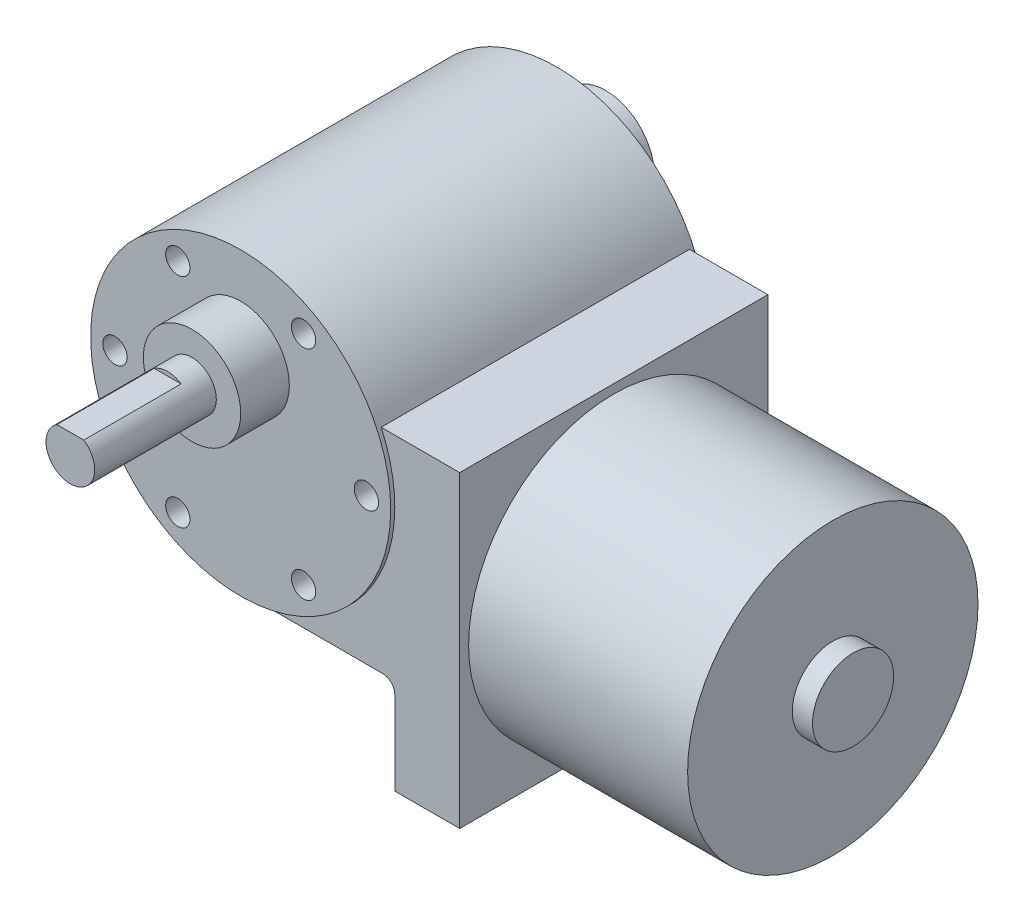
ISO-10303-21;
HEADER;
FILE_DESCRIPTION(('STEP AP214'),'2;1');
FILE_NAME('part.step','',(''),(''),'','','');
FILE_SCHEMA(('AUTOMOTIVE_DESIGN { 1 0 10303 214 1 1 1 1 }'));
ENDSEC;
DATA;
#1=APPLICATION_CONTEXT('core data for automotive mechanical design processes');
#2=APPLICATION_PROTOCOL_DEFINITION('international standard','automotive_design',2000,#1);
#3=PRODUCT_CONTEXT('',#1,'mechanical');
#4=PRODUCT('Part','Part','',(#3));
#5=PRODUCT_RELATED_PRODUCT_CATEGORY('part','',(#4));
#6=PRODUCT_DEFINITION_FORMATION('','',#4);
#7=PRODUCT_DEFINITION_CONTEXT('part definition',#1,'design');
#8=PRODUCT_DEFINITION('design','',#6,#7);
#9=PRODUCT_DEFINITION_SHAPE('','',#8);
#10=(LENGTH_UNIT() NAMED_UNIT(*) SI_UNIT(.MILLI.,.METRE.));
#11=(NAMED_UNIT(*) PLANE_ANGLE_UNIT() SI_UNIT($,.RADIAN.));
#12=(NAMED_UNIT(*) SI_UNIT($,.STERADIAN.) SOLID_ANGLE_UNIT());
#13=UNCERTAINTY_MEASURE_WITH_UNIT(LENGTH_MEASURE(1.E-05),#10,'distance_accuracy_value','');
#14=(GEOMETRIC_REPRESENTATION_CONTEXT(3) GLOBAL_UNCERTAINTY_ASSIGNED_CONTEXT((#13)) GLOBAL_UNIT_ASSIGNED_CONTEXT((#10,
#11,#12)) REPRESENTATION_CONTEXT('',''));
#15=CARTESIAN_POINT('',(0.,0.,0.));
#16=DIRECTION('',(0.,0.,1.));
#17=DIRECTION('',(1.,0.,0.));
#18=AXIS2_PLACEMENT_3D('',#15,#16,#17);
#19=CARTESIAN_POINT('',(0.,-7.,-39.));
#20=DIRECTION('',(0.,0.,1.));
#21=DIRECTION('',(1.,0.,0.));
#22=AXIS2_PLACEMENT_3D('',#19,#20,#21);
#23=CYLINDRICAL_SURFACE('',#22,18.5);
#24=CARTESIAN_POINT('',(0.,-7.,-39.));
#25=DIRECTION('',(0.,0.,1.));
#26=DIRECTION('',(1.,0.,0.));
#27=AXIS2_PLACEMENT_3D('',#24,#25,#26);
#28=CIRCLE('',#27,18.5);
#29=CARTESIAN_POINT('',(18.5,-7.,-39.));
#30=VERTEX_POINT('',#29);
#31=EDGE_CURVE('E166',#30,#30,#28,.T.);
#32=ORIENTED_EDGE('',*,*,#31,.T.);
#33=EDGE_LOOP('',(#32));
#34=FACE_BOUND('',#33,.T.);
#35=CARTESIAN_POINT('',(0.,-7.,0.));
#36=DIRECTION('',(0.,0.,1.));
#37=DIRECTION('',(1.,0.,0.));
#38=AXIS2_PLACEMENT_3D('',#35,#36,#37);
#39=CIRCLE('',#38,18.5);
#40=CARTESIAN_POINT('',(18.5,-7.,0.));
#41=VERTEX_POINT('',#40);
#42=EDGE_CURVE('E165',#41,#41,#39,.T.);
#43=ORIENTED_EDGE('',*,*,#42,.F.);
#44=EDGE_LOOP('',(#43));
#45=FACE_BOUND('',#44,.T.);
#46=CARTESIAN_POINT('',(0.,-7.,-0.5));
#47=DIRECTION('',(0.,0.,-1.));
#48=DIRECTION('',(0.,1.,0.));
#49=AXIS2_PLACEMENT_3D('',#46,#47,#48);
#50=CIRCLE('',#49,18.5);
#51=CARTESIAN_POINT('',(16.8214149226514,0.7,-0.5));
#52=VERTEX_POINT('',#51);
#53=CARTESIAN_POINT('',(0.,-25.5,-0.500000000000001));
#54=VERTEX_POINT('',#53);
#55=EDGE_CURVE('E116',#52,#54,#50,.T.);
#56=ORIENTED_EDGE('',*,*,#55,.F.);
#57=DIRECTION('',(0.,0.,1.));
#58=VECTOR('',#57,1.);
#59=CARTESIAN_POINT('',(16.8214149226514,0.7,-39.));
#60=LINE('',#59,#58);
#61=CARTESIAN_POINT('',(16.8214149226514,0.7,-38.5));
#62=VERTEX_POINT('',#61);
#63=EDGE_CURVE('E121',#62,#52,#60,.T.);
#64=ORIENTED_EDGE('',*,*,#63,.F.);
#65=CARTESIAN_POINT('',(0.,-7.,-38.5));
#66=DIRECTION('',(0.,0.,1.));
#67=DIRECTION('',(1.,0.,0.));
#68=AXIS2_PLACEMENT_3D('',#65,#66,#67);
#69=CIRCLE('',#68,18.5);
#70=CARTESIAN_POINT('',(0.,-25.5,-38.5));
#71=VERTEX_POINT('',#70);
#72=EDGE_CURVE('E104',#71,#62,#69,.T.);
#73=ORIENTED_EDGE('',*,*,#72,.F.);
#74=DIRECTION('',(0.,0.,1.));
#75=VECTOR('',#74,1.);
#76=CARTESIAN_POINT('',(0.,-25.5,-39.));
#77=LINE('',#76,#75);
#78=EDGE_CURVE('E115',#71,#54,#77,.T.);
#79=ORIENTED_EDGE('',*,*,#78,.T.);
#80=EDGE_LOOP('',(#56,#64,#73,#79));
#81=FACE_BOUND('',#80,.T.);
#82=ADVANCED_FACE('F34',(#34,#45,#81),#23,.T.);
#83=CARTESIAN_POINT('',(0.,0.,21.));
#84=DIRECTION('',(0.,0.,-1.));
#85=DIRECTION('',(-1.,0.,0.));
#86=AXIS2_PLACEMENT_3D('',#83,#84,#85);
#87=CYLINDRICAL_SURFACE('',#86,3.);
#88=CARTESIAN_POINT('',(0.,0.,6.));
#89=DIRECTION('',(0.,0.,1.));
#90=DIRECTION('',(1.,0.,0.));
#91=AXIS2_PLACEMENT_3D('',#88,#89,#90);
#92=CIRCLE('',#91,3.);
#93=CARTESIAN_POINT('',(3.,0.,6.));
#94=VERTEX_POINT('',#93);
#95=EDGE_CURVE('E187',#94,#94,#92,.T.);
#96=ORIENTED_EDGE('',*,*,#95,.T.);
#97=EDGE_LOOP('',(#96));
#98=FACE_BOUND('',#97,.T.);
#99=CARTESIAN_POINT('',(0.,0.,9.));
#100=DIRECTION('',(0.,0.,1.));
#101=DIRECTION('',(1.,0.,0.));
#102=AXIS2_PLACEMENT_3D('',#99,#100,#101);
#103=CIRCLE('',#102,3.);
#104=CARTESIAN_POINT('',(1.6583123951777,2.5,9.));
#105=VERTEX_POINT('',#104);
#106=CARTESIAN_POINT('',(-1.6583123951777,2.5,9.));
#107=VERTEX_POINT('',#106);
#108=EDGE_CURVE('E190',#105,#107,#103,.T.);
#109=ORIENTED_EDGE('',*,*,#108,.F.);
#110=DIRECTION('',(0.,0.,1.));
#111=VECTOR('',#110,1.);
#112=CARTESIAN_POINT('',(1.6583123951777,2.5,9.));
#113=LINE('',#112,#111);
#114=CARTESIAN_POINT('',(1.6583123951777,2.5,21.));
#115=VERTEX_POINT('',#114);
#116=EDGE_CURVE('E175',#105,#115,#113,.T.);
#117=ORIENTED_EDGE('',*,*,#116,.T.);
#118=CARTESIAN_POINT('',(0.,0.,21.));
#119=DIRECTION('',(0.,0.,1.));
#120=DIRECTION('',(1.,0.,0.));
#121=AXIS2_PLACEMENT_3D('',#118,#119,#120);
#122=CIRCLE('',#121,3.);
#123=CARTESIAN_POINT('',(-1.6583123951777,2.5,21.));
#124=VERTEX_POINT('',#123);
#125=EDGE_CURVE('E181',#124,#115,#122,.T.);
#126=ORIENTED_EDGE('',*,*,#125,.F.);
#127=DIRECTION('',(0.,0.,1.));
#128=VECTOR('',#127,1.);
#129=CARTESIAN_POINT('',(-1.6583123951777,2.5,9.));
#130=LINE('',#129,#128);
#131=EDGE_CURVE('E179',#107,#124,#130,.T.);
#132=ORIENTED_EDGE('',*,*,#131,.F.);
#133=EDGE_LOOP('',(#109,#117,#126,#132));
#134=FACE_BOUND('',#133,.T.);
#135=ADVANCED_FACE('F281',(#98,#134),#87,.T.);
#136=CARTESIAN_POINT('',(0.,0.,21.));
#137=DIRECTION('',(0.,0.,1.));
#138=DIRECTION('',(1.,0.,0.));
#139=AXIS2_PLACEMENT_3D('',#136,#137,#138);
#140=PLANE('',#139);
#141=ORIENTED_EDGE('',*,*,#125,.T.);
#142=DIRECTION('',(-1.,0.,0.));
#143=VECTOR('',#142,1.);
#144=CARTESIAN_POINT('',(-1.6583123951777,2.5,21.));
#145=LINE('',#144,#143);
#146=EDGE_CURVE('E176',#115,#124,#145,.T.);
#147=ORIENTED_EDGE('',*,*,#146,.T.);
#148=EDGE_LOOP('',(#141,#147));
#149=FACE_BOUND('',#148,.T.);
#150=ADVANCED_FACE('F287',(#149),#140,.T.);
#151=CARTESIAN_POINT('',(0.,0.,6.));
#152=DIRECTION('',(0.,0.,-1.));
#153=DIRECTION('',(-1.,0.,0.));
#154=AXIS2_PLACEMENT_3D('',#151,#152,#153);
#155=CYLINDRICAL_SURFACE('',#154,6.);
#156=CARTESIAN_POINT('',(0.,0.,6.));
#157=DIRECTION('',(0.,0.,1.));
#158=DIRECTION('',(1.,0.,0.));
#159=AXIS2_PLACEMENT_3D('',#156,#157,#158);
#160=CIRCLE('',#159,6.);
#161=CARTESIAN_POINT('',(6.,0.,6.));
#162=VERTEX_POINT('',#161);
#163=EDGE_CURVE('E186',#162,#162,#160,.T.);
#164=ORIENTED_EDGE('',*,*,#163,.F.);
#165=EDGE_LOOP('',(#164));
#166=FACE_BOUND('',#165,.T.);
#167=CARTESIAN_POINT('',(0.,0.,0.));
#168=DIRECTION('',(0.,0.,1.));
#169=DIRECTION('',(1.,0.,0.));
#170=AXIS2_PLACEMENT_3D('',#167,#168,#169);
#171=CIRCLE('',#170,6.);
#172=CARTESIAN_POINT('',(6.,0.,0.));
#173=VERTEX_POINT('',#172);
#174=EDGE_CURVE('E169',#173,#173,#171,.T.);
#175=ORIENTED_EDGE('',*,*,#174,.T.);
#176=EDGE_LOOP('',(#175));
#177=FACE_BOUND('',#176,.T.);
#178=ADVANCED_FACE('F302',(#166,#177),#155,.T.);
#179=CARTESIAN_POINT('',(0.,0.,6.));
#180=DIRECTION('',(0.,0.,1.));
#181=DIRECTION('',(1.,0.,0.));
#182=AXIS2_PLACEMENT_3D('',#179,#180,#181);
#183=PLANE('',#182);
#184=ORIENTED_EDGE('',*,*,#95,.F.);
#185=EDGE_LOOP('',(#184));
#186=FACE_BOUND('',#185,.T.);
#187=ORIENTED_EDGE('',*,*,#163,.T.);
#188=EDGE_LOOP('',(#187));
#189=FACE_BOUND('',#188,.T.);
#190=ADVANCED_FACE('F299',(#186,#189),#183,.T.);
#191=CARTESIAN_POINT('',(0.,0.,9.));
#192=DIRECTION('',(0.,0.,1.));
#193=DIRECTION('',(1.,0.,0.));
#194=AXIS2_PLACEMENT_3D('',#191,#192,#193);
#195=PLANE('',#194);
#196=ORIENTED_EDGE('',*,*,#108,.T.);
#197=DIRECTION('',(-1.,0.,0.));
#198=VECTOR('',#197,1.);
#199=CARTESIAN_POINT('',(-1.6583123951777,2.5,9.));
#200=LINE('',#199,#198);
#201=EDGE_CURVE('E172',#105,#107,#200,.T.);
#202=ORIENTED_EDGE('',*,*,#201,.F.);
#203=EDGE_LOOP('',(#196,#202));
#204=FACE_BOUND('',#203,.T.);
#205=ADVANCED_FACE('F295',(#204),#195,.T.);
#206=CARTESIAN_POINT('',(-1.6583123951777,2.5,9.));
#207=DIRECTION('',(0.,1.,0.));
#208=DIRECTION('',(0.,0.,1.));
#209=AXIS2_PLACEMENT_3D('',#206,#207,#208);
#210=PLANE('',#209);
#211=ORIENTED_EDGE('',*,*,#146,.F.);
#212=ORIENTED_EDGE('',*,*,#116,.F.);
#213=ORIENTED_EDGE('',*,*,#201,.T.);
#214=ORIENTED_EDGE('',*,*,#131,.T.);
#215=EDGE_LOOP('',(#211,#212,#213,#214));
#216=FACE_BOUND('',#215,.T.);
#217=ADVANCED_FACE('F292',(#216),#210,.T.);
#218=CARTESIAN_POINT('',(0.,-7.,-39.));
#219=DIRECTION('',(0.,0.,1.));
#220=DIRECTION('',(1.,0.,0.));
#221=AXIS2_PLACEMENT_3D('',#218,#219,#220);
#222=PLANE('',#221);
#223=CARTESIAN_POINT('',(0.,0.,-39.));
#224=DIRECTION('',(0.,0.,1.));
#225=DIRECTION('',(1.,0.,0.));
#226=AXIS2_PLACEMENT_3D('',#223,#224,#225);
#227=CIRCLE('',#226,6.);
#228=CARTESIAN_POINT('',(6.,0.,-39.));
#229=VERTEX_POINT('',#228);
#230=EDGE_CURVE('E196',#229,#229,#227,.F.);
#231=ORIENTED_EDGE('',*,*,#230,.F.);
#232=EDGE_LOOP('',(#231));
#233=FACE_BOUND('',#232,.T.);
#234=ORIENTED_EDGE('',*,*,#31,.F.);
#235=EDGE_LOOP('',(#234));
#236=FACE_BOUND('',#235,.T.);
#237=ADVANCED_FACE('F264',(#233,#236),#222,.F.);
#238=CARTESIAN_POINT('',(0.,-7.,0.));
#239=DIRECTION('',(0.,0.,1.));
#240=DIRECTION('',(1.,0.,0.));
#241=AXIS2_PLACEMENT_3D('',#238,#239,#240);
#242=PLANE('',#241);
#243=CARTESIAN_POINT('',(-15.5,-7.,0.));
#244=DIRECTION('',(0.,0.,1.));
#245=DIRECTION('',(1.,0.,0.));
#246=AXIS2_PLACEMENT_3D('',#243,#244,#245);
#247=CIRCLE('',#246,1.5);
#248=CARTESIAN_POINT('',(-14.,-7.,0.));
#249=VERTEX_POINT('',#248);
#250=EDGE_CURVE('E240',#249,#249,#247,.T.);
#251=ORIENTED_EDGE('',*,*,#250,.F.);
#252=EDGE_LOOP('',(#251));
#253=FACE_BOUND('',#252,.T.);
#254=CARTESIAN_POINT('',(-7.74999999999999,-20.4233937586588,0.));
#255=DIRECTION('',(0.,0.,1.));
#256=DIRECTION('',(1.,0.,0.));
#257=AXIS2_PLACEMENT_3D('',#254,#255,#256);
#258=CIRCLE('',#257,1.50000000000006);
#259=CARTESIAN_POINT('',(-6.24999999999993,-20.4233937586588,0.));
#260=VERTEX_POINT('',#259);
#261=EDGE_CURVE('E241',#260,#260,#258,.T.);
#262=ORIENTED_EDGE('',*,*,#261,.F.);
#263=EDGE_LOOP('',(#262));
#264=FACE_BOUND('',#263,.T.);
#265=CARTESIAN_POINT('',(7.75000000000001,-20.4233937586588,0.));
#266=DIRECTION('',(0.,0.,1.));
#267=DIRECTION('',(1.,0.,0.));
#268=AXIS2_PLACEMENT_3D('',#265,#266,#267);
#269=CIRCLE('',#268,1.50000000000005);
#270=CARTESIAN_POINT('',(9.25000000000005,-20.4233937586588,0.));
#271=VERTEX_POINT('',#270);
#272=EDGE_CURVE('E215',#271,#271,#269,.T.);
#273=ORIENTED_EDGE('',*,*,#272,.F.);
#274=EDGE_LOOP('',(#273));
#275=FACE_BOUND('',#274,.T.);
#276=CARTESIAN_POINT('',(15.5,-7.00000000000011,0.));
#277=DIRECTION('',(0.,0.,1.));
#278=DIRECTION('',(1.,0.,0.));
#279=AXIS2_PLACEMENT_3D('',#276,#277,#278);
#280=CIRCLE('',#279,1.5);
#281=CARTESIAN_POINT('',(17.,-7.00000000000011,0.));
#282=VERTEX_POINT('',#281);
#283=EDGE_CURVE('E222',#282,#282,#280,.T.);
#284=ORIENTED_EDGE('',*,*,#283,.F.);
#285=EDGE_LOOP('',(#284));
#286=FACE_BOUND('',#285,.T.);
#287=CARTESIAN_POINT('',(7.75000000000006,6.42339375865877,0.));
#288=DIRECTION('',(0.,0.,1.));
#289=DIRECTION('',(1.,0.,0.));
#290=AXIS2_PLACEMENT_3D('',#287,#288,#289);
#291=CIRCLE('',#290,1.5);
#292=CARTESIAN_POINT('',(9.25000000000007,6.42339375865877,0.));
#293=VERTEX_POINT('',#292);
#294=EDGE_CURVE('E228',#293,#293,#291,.T.);
#295=ORIENTED_EDGE('',*,*,#294,.F.);
#296=EDGE_LOOP('',(#295));
#297=FACE_BOUND('',#296,.T.);
#298=CARTESIAN_POINT('',(-7.74999999999997,6.42339375865882,0.));
#299=DIRECTION('',(0.,0.,1.));
#300=DIRECTION('',(1.,0.,0.));
#301=AXIS2_PLACEMENT_3D('',#298,#299,#300);
#302=CIRCLE('',#301,1.5);
#303=CARTESIAN_POINT('',(-6.24999999999997,6.42339375865882,0.));
#304=VERTEX_POINT('',#303);
#305=EDGE_CURVE('E234',#304,#304,#302,.T.);
#306=ORIENTED_EDGE('',*,*,#305,.F.);
#307=EDGE_LOOP('',(#306));
#308=FACE_BOUND('',#307,.T.);
#309=ORIENTED_EDGE('',*,*,#174,.F.);
#310=EDGE_LOOP('',(#309));
#311=FACE_BOUND('',#310,.T.);
#312=ORIENTED_EDGE('',*,*,#42,.T.);
#313=EDGE_LOOP('',(#312));
#314=FACE_BOUND('',#313,.T.);
#315=ADVANCED_FACE('F260',(#253,#264,#275,#286,#297,#308,#311,#314),#242,.T.);
#316=CARTESIAN_POINT('',(0.,0.,-45.));
#317=DIRECTION('',(0.,0.,1.));
#318=DIRECTION('',(1.,0.,0.));
#319=AXIS2_PLACEMENT_3D('',#316,#317,#318);
#320=CYLINDRICAL_SURFACE('',#319,6.);
#321=CARTESIAN_POINT('',(0.,0.,-45.));
#322=DIRECTION('',(0.,0.,-1.));
#323=DIRECTION('',(-1.,0.,0.));
#324=AXIS2_PLACEMENT_3D('',#321,#322,#323);
#325=CIRCLE('',#324,6.);
#326=CARTESIAN_POINT('',(-6.,0.,-45.));
#327=VERTEX_POINT('',#326);
#328=EDGE_CURVE('E161',#327,#327,#325,.T.);
#329=ORIENTED_EDGE('',*,*,#328,.F.);
#330=EDGE_LOOP('',(#329));
#331=FACE_BOUND('',#330,.T.);
#332=ORIENTED_EDGE('',*,*,#230,.T.);
#333=EDGE_LOOP('',(#332));
#334=FACE_BOUND('',#333,.T.);
#335=ADVANCED_FACE('F263',(#331,#334),#320,.T.);
#336=CARTESIAN_POINT('',(0.,0.,-45.));
#337=DIRECTION('',(0.,0.,-1.));
#338=DIRECTION('',(-1.,0.,0.));
#339=AXIS2_PLACEMENT_3D('',#336,#337,#338);
#340=PLANE('',#339);
#341=ORIENTED_EDGE('',*,*,#328,.T.);
#342=EDGE_LOOP('',(#341));
#343=FACE_BOUND('',#342,.T.);
#344=ADVANCED_FACE('F347',(#343),#340,.T.);
#345=CARTESIAN_POINT('',(-18.502,-25.5,-38.5));
#346=DIRECTION('',(0.,1.,0.));
#347=DIRECTION('',(0.,0.,1.));
#348=AXIS2_PLACEMENT_3D('',#345,#346,#347);
#349=PLANE('',#348);
#350=DIRECTION('',(1.,0.,0.));
#351=VECTOR('',#350,1.);
#352=CARTESIAN_POINT('',(-18.502,-25.5,-38.5));
#353=LINE('',#352,#351);
#354=CARTESIAN_POINT('',(17.,-25.5,-38.5));
#355=VERTEX_POINT('',#354);
#356=EDGE_CURVE('E111',#71,#355,#353,.T.);
#357=ORIENTED_EDGE('',*,*,#356,.T.);
#358=DIRECTION('',(0.,0.,1.));
#359=VECTOR('',#358,1.);
#360=CARTESIAN_POINT('',(17.,-25.5,-38.5));
#361=LINE('',#360,#359);
#362=CARTESIAN_POINT('',(17.,-25.5,-0.5));
#363=VERTEX_POINT('',#362);
#364=EDGE_CURVE('E199',#355,#363,#361,.T.);
#365=ORIENTED_EDGE('',*,*,#364,.T.);
#366=DIRECTION('',(1.,0.,0.));
#367=VECTOR('',#366,1.);
#368=CARTESIAN_POINT('',(-18.502,-25.5,-0.5));
#369=LINE('',#368,#367);
#370=EDGE_CURVE('E154',#54,#363,#369,.T.);
#371=ORIENTED_EDGE('',*,*,#370,.F.);
#372=ORIENTED_EDGE('',*,*,#78,.F.);
#373=EDGE_LOOP('',(#357,#365,#371,#372));
#374=FACE_BOUND('',#373,.T.);
#375=ADVANCED_FACE('F355',(#374),#349,.F.);
#376=CARTESIAN_POINT('',(-18.502,0.7,-0.5));
#377=DIRECTION('',(0.,0.,-1.));
#378=DIRECTION('',(0.,1.,0.));
#379=AXIS2_PLACEMENT_3D('',#376,#377,#378);
#380=PLANE('',#379);
#381=ORIENTED_EDGE('',*,*,#370,.T.);
#382=CARTESIAN_POINT('',(17.,-27.,-0.5));
#383=DIRECTION('',(0.,0.,-1.));
#384=DIRECTION('',(0.,1.,0.));
#385=AXIS2_PLACEMENT_3D('',#382,#383,#384);
#386=CIRCLE('',#385,1.5);
#387=CARTESIAN_POINT('',(18.5,-27.,-0.5));
#388=VERTEX_POINT('',#387);
#389=EDGE_CURVE('E42',#363,#388,#386,.T.);
#390=ORIENTED_EDGE('',*,*,#389,.T.);
#391=DIRECTION('',(0.,-1.,0.));
#392=VECTOR('',#391,1.);
#393=CARTESIAN_POINT('',(18.5,-37.3,-0.5));
#394=LINE('',#393,#392);
#395=CARTESIAN_POINT('',(18.5,-37.3,-0.5));
#396=VERTEX_POINT('',#395);
#397=EDGE_CURVE('E141',#388,#396,#394,.T.);
#398=ORIENTED_EDGE('',*,*,#397,.T.);
#399=DIRECTION('',(1.,0.,0.));
#400=VECTOR('',#399,1.);
#401=CARTESIAN_POINT('',(18.5,-37.3,-0.5));
#402=LINE('',#401,#400);
#403=CARTESIAN_POINT('',(26.5,-37.3,-0.5));
#404=VERTEX_POINT('',#403);
#405=EDGE_CURVE('E155',#396,#404,#402,.T.);
#406=ORIENTED_EDGE('',*,*,#405,.T.);
#407=DIRECTION('',(0.,-1.,0.));
#408=VECTOR('',#407,1.);
#409=CARTESIAN_POINT('',(26.5,-37.3,-0.5));
#410=LINE('',#409,#408);
#411=CARTESIAN_POINT('',(26.5,0.7,-0.5));
#412=VERTEX_POINT('',#411);
#413=EDGE_CURVE('E147',#412,#404,#410,.T.);
#414=ORIENTED_EDGE('',*,*,#413,.F.);
#415=DIRECTION('',(1.,0.,0.));
#416=VECTOR('',#415,1.);
#417=CARTESIAN_POINT('',(18.5,0.7,-0.5));
#418=LINE('',#417,#416);
#419=EDGE_CURVE('E125',#52,#412,#418,.T.);
#420=ORIENTED_EDGE('',*,*,#419,.F.);
#421=ORIENTED_EDGE('',*,*,#55,.T.);
#422=EDGE_LOOP('',(#381,#390,#398,#406,#414,#420,#421));
#423=FACE_BOUND('',#422,.T.);
#424=ADVANCED_FACE('F363',(#423),#380,.F.);
#425=CARTESIAN_POINT('',(-18.502,0.7,-38.5));
#426=DIRECTION('',(0.,0.,1.));
#427=DIRECTION('',(1.,0.,0.));
#428=AXIS2_PLACEMENT_3D('',#425,#426,#427);
#429=PLANE('',#428);
#430=ORIENTED_EDGE('',*,*,#356,.F.);
#431=ORIENTED_EDGE('',*,*,#72,.T.);
#432=DIRECTION('',(1.,0.,0.));
#433=VECTOR('',#432,1.);
#434=CARTESIAN_POINT('',(18.5,0.7,-38.5));
#435=LINE('',#434,#433);
#436=CARTESIAN_POINT('',(26.5,0.7,-38.5));
#437=VERTEX_POINT('',#436);
#438=EDGE_CURVE('E108',#62,#437,#435,.T.);
#439=ORIENTED_EDGE('',*,*,#438,.T.);
#440=DIRECTION('',(0.,1.,0.));
#441=VECTOR('',#440,1.);
#442=CARTESIAN_POINT('',(26.5,-37.3,-38.5));
#443=LINE('',#442,#441);
#444=CARTESIAN_POINT('',(26.5,-37.3,-38.5));
#445=VERTEX_POINT('',#444);
#446=EDGE_CURVE('E129',#445,#437,#443,.T.);
#447=ORIENTED_EDGE('',*,*,#446,.F.);
#448=DIRECTION('',(1.,0.,0.));
#449=VECTOR('',#448,1.);
#450=CARTESIAN_POINT('',(18.5,-37.3,-38.5));
#451=LINE('',#450,#449);
#452=CARTESIAN_POINT('',(18.5,-37.3,-38.5));
#453=VERTEX_POINT('',#452);
#454=EDGE_CURVE('E152',#453,#445,#451,.T.);
#455=ORIENTED_EDGE('',*,*,#454,.F.);
#456=DIRECTION('',(0.,1.,0.));
#457=VECTOR('',#456,1.);
#458=CARTESIAN_POINT('',(18.5,-37.3,-38.5));
#459=LINE('',#458,#457);
#460=CARTESIAN_POINT('',(18.5,-27.,-38.5));
#461=VERTEX_POINT('',#460);
#462=EDGE_CURVE('E139',#453,#461,#459,.T.);
#463=ORIENTED_EDGE('',*,*,#462,.T.);
#464=CARTESIAN_POINT('',(17.,-27.,-38.5));
#465=DIRECTION('',(0.,0.,1.));
#466=DIRECTION('',(1.,0.,0.));
#467=AXIS2_PLACEMENT_3D('',#464,#465,#466);
#468=CIRCLE('',#467,1.5);
#469=EDGE_CURVE('E12',#461,#355,#468,.T.);
#470=ORIENTED_EDGE('',*,*,#469,.T.);
#471=EDGE_LOOP('',(#430,#431,#439,#447,#455,#463,#470));
#472=FACE_BOUND('',#471,.T.);
#473=ADVANCED_FACE('F106',(#472),#429,.F.);
#474=CARTESIAN_POINT('',(18.5,0.,0.));
#475=DIRECTION('',(-1.,0.,0.));
#476=DIRECTION('',(0.,0.,1.));
#477=AXIS2_PLACEMENT_3D('',#474,#475,#476);
#478=PLANE('',#477);
#479=ORIENTED_EDGE('',*,*,#397,.F.);
#480=DIRECTION('',(0.,0.,1.));
#481=VECTOR('',#480,1.);
#482=CARTESIAN_POINT('',(18.5,-27.,0.));
#483=LINE('',#482,#481);
#484=EDGE_CURVE('E55',#388,#461,#483,.F.);
#485=ORIENTED_EDGE('',*,*,#484,.T.);
#486=ORIENTED_EDGE('',*,*,#462,.F.);
#487=DIRECTION('',(0.,0.,-1.));
#488=VECTOR('',#487,1.);
#489=CARTESIAN_POINT('',(18.5,-37.3,-0.5));
#490=LINE('',#489,#488);
#491=EDGE_CURVE('E126',#396,#453,#490,.T.);
#492=ORIENTED_EDGE('',*,*,#491,.F.);
#493=EDGE_LOOP('',(#479,#485,#486,#492));
#494=FACE_BOUND('',#493,.T.);
#495=ADVANCED_FACE('F365',(#494),#478,.T.);
#496=CARTESIAN_POINT('',(18.5,-37.3,-0.5));
#497=DIRECTION('',(0.,-1.,0.));
#498=DIRECTION('',(0.,0.,-1.));
#499=AXIS2_PLACEMENT_3D('',#496,#497,#498);
#500=PLANE('',#499);
#501=DIRECTION('',(0.,0.,-1.));
#502=VECTOR('',#501,1.);
#503=CARTESIAN_POINT('',(26.5,-37.3,-0.5));
#504=LINE('',#503,#502);
#505=EDGE_CURVE('E142',#404,#445,#504,.T.);
#506=ORIENTED_EDGE('',*,*,#505,.F.);
#507=ORIENTED_EDGE('',*,*,#405,.F.);
#508=ORIENTED_EDGE('',*,*,#491,.T.);
#509=ORIENTED_EDGE('',*,*,#454,.T.);
#510=EDGE_LOOP('',(#506,#507,#508,#509));
#511=FACE_BOUND('',#510,.T.);
#512=ADVANCED_FACE('F384',(#511),#500,.T.);
#513=CARTESIAN_POINT('',(18.5,0.7,-0.5));
#514=DIRECTION('',(0.,1.,0.));
#515=DIRECTION('',(0.,0.,1.));
#516=AXIS2_PLACEMENT_3D('',#513,#514,#515);
#517=PLANE('',#516);
#518=DIRECTION('',(0.,0.,1.));
#519=VECTOR('',#518,1.);
#520=CARTESIAN_POINT('',(26.5,0.7,-0.5));
#521=LINE('',#520,#519);
#522=EDGE_CURVE('E123',#437,#412,#521,.T.);
#523=ORIENTED_EDGE('',*,*,#522,.F.);
#524=ORIENTED_EDGE('',*,*,#438,.F.);
#525=ORIENTED_EDGE('',*,*,#63,.T.);
#526=ORIENTED_EDGE('',*,*,#419,.T.);
#527=EDGE_LOOP('',(#523,#524,#525,#526));
#528=FACE_BOUND('',#527,.T.);
#529=ADVANCED_FACE('F120',(#528),#517,.T.);
#530=CARTESIAN_POINT('',(26.5,0.,0.));
#531=DIRECTION('',(-1.,0.,0.));
#532=DIRECTION('',(0.,0.,1.));
#533=AXIS2_PLACEMENT_3D('',#530,#531,#532);
#534=PLANE('',#533);
#535=CARTESIAN_POINT('',(26.5,-18.3,-19.5));
#536=DIRECTION('',(1.,0.,0.));
#537=DIRECTION('',(0.,0.,-1.));
#538=AXIS2_PLACEMENT_3D('',#535,#536,#537);
#539=CIRCLE('',#538,17.9);
#540=CARTESIAN_POINT('',(26.5,-18.3,-37.4));
#541=VERTEX_POINT('',#540);
#542=EDGE_CURVE('E138',#541,#541,#539,.T.);
#543=ORIENTED_EDGE('',*,*,#542,.F.);
#544=EDGE_LOOP('',(#543));
#545=FACE_BOUND('',#544,.T.);
#546=ORIENTED_EDGE('',*,*,#446,.T.);
#547=ORIENTED_EDGE('',*,*,#522,.T.);
#548=ORIENTED_EDGE('',*,*,#413,.T.);
#549=ORIENTED_EDGE('',*,*,#505,.T.);
#550=EDGE_LOOP('',(#546,#547,#548,#549));
#551=FACE_BOUND('',#550,.T.);
#552=ADVANCED_FACE('F399',(#545,#551),#534,.F.);
#553=CARTESIAN_POINT('',(53.5,-18.3,-19.5));
#554=DIRECTION('',(-1.,0.,0.));
#555=DIRECTION('',(0.,0.,1.));
#556=AXIS2_PLACEMENT_3D('',#553,#554,#555);
#557=CYLINDRICAL_SURFACE('',#556,17.9);
#558=CARTESIAN_POINT('',(53.5,-18.3,-19.5));
#559=DIRECTION('',(1.,0.,0.));
#560=DIRECTION('',(0.,0.,-1.));
#561=AXIS2_PLACEMENT_3D('',#558,#559,#560);
#562=CIRCLE('',#561,17.9);
#563=CARTESIAN_POINT('',(53.5,-18.3,-37.4));
#564=VERTEX_POINT('',#563);
#565=EDGE_CURVE('E130',#564,#564,#562,.T.);
#566=ORIENTED_EDGE('',*,*,#565,.F.);
#567=EDGE_LOOP('',(#566));
#568=FACE_BOUND('',#567,.T.);
#569=ORIENTED_EDGE('',*,*,#542,.T.);
#570=EDGE_LOOP('',(#569));
#571=FACE_BOUND('',#570,.T.);
#572=ADVANCED_FACE('F406',(#568,#571),#557,.T.);
#573=CARTESIAN_POINT('',(53.5,-18.3,-19.5));
#574=DIRECTION('',(1.,0.,0.));
#575=DIRECTION('',(0.,0.,-1.));
#576=AXIS2_PLACEMENT_3D('',#573,#574,#575);
#577=PLANE('',#576);
#578=CARTESIAN_POINT('',(53.5,-18.3,-19.5));
#579=DIRECTION('',(1.,0.,0.));
#580=DIRECTION('',(0.,0.,-1.));
#581=AXIS2_PLACEMENT_3D('',#578,#579,#580);
#582=CIRCLE('',#581,5.);
#583=CARTESIAN_POINT('',(53.5,-18.3,-24.5));
#584=VERTEX_POINT('',#583);
#585=EDGE_CURVE('E202',#584,#584,#582,.T.);
#586=ORIENTED_EDGE('',*,*,#585,.F.);
#587=EDGE_LOOP('',(#586));
#588=FACE_BOUND('',#587,.T.);
#589=ORIENTED_EDGE('',*,*,#565,.T.);
#590=EDGE_LOOP('',(#589));
#591=FACE_BOUND('',#590,.T.);
#592=ADVANCED_FACE('F414',(#588,#591),#577,.T.);
#593=CARTESIAN_POINT('',(56.,-18.3,-19.5));
#594=DIRECTION('',(-1.,0.,0.));
#595=DIRECTION('',(0.,0.,1.));
#596=AXIS2_PLACEMENT_3D('',#593,#594,#595);
#597=CYLINDRICAL_SURFACE('',#596,5.);
#598=CARTESIAN_POINT('',(56.,-18.3,-19.5));
#599=DIRECTION('',(1.,0.,0.));
#600=DIRECTION('',(0.,0.,-1.));
#601=AXIS2_PLACEMENT_3D('',#598,#599,#600);
#602=CIRCLE('',#601,5.);
#603=CARTESIAN_POINT('',(56.,-18.3,-24.5));
#604=VERTEX_POINT('',#603);
#605=EDGE_CURVE('E134',#604,#604,#602,.T.);
#606=ORIENTED_EDGE('',*,*,#605,.F.);
#607=EDGE_LOOP('',(#606));
#608=FACE_BOUND('',#607,.T.);
#609=ORIENTED_EDGE('',*,*,#585,.T.);
#610=EDGE_LOOP('',(#609));
#611=FACE_BOUND('',#610,.T.);
#612=ADVANCED_FACE('F422',(#608,#611),#597,.T.);
#613=CARTESIAN_POINT('',(56.,-18.3,-19.5));
#614=DIRECTION('',(1.,0.,0.));
#615=DIRECTION('',(0.,0.,-1.));
#616=AXIS2_PLACEMENT_3D('',#613,#614,#615);
#617=PLANE('',#616);
#618=ORIENTED_EDGE('',*,*,#605,.T.);
#619=EDGE_LOOP('',(#618));
#620=FACE_BOUND('',#619,.T.);
#621=ADVANCED_FACE('F430',(#620),#617,.T.);
#622=CARTESIAN_POINT('',(-7.74999999999997,6.42339375865882,-4.));
#623=DIRECTION('',(0.,0.,1.));
#624=DIRECTION('',(1.,0.,0.));
#625=AXIS2_PLACEMENT_3D('',#622,#623,#624);
#626=CYLINDRICAL_SURFACE('',#625,1.5);
#627=CARTESIAN_POINT('',(-7.74999999999997,6.42339375865882,-4.));
#628=DIRECTION('',(0.,0.,1.));
#629=DIRECTION('',(1.,0.,0.));
#630=AXIS2_PLACEMENT_3D('',#627,#628,#629);
#631=CIRCLE('',#630,1.5);
#632=CARTESIAN_POINT('',(-6.24999999999997,6.42339375865882,-4.));
#633=VERTEX_POINT('',#632);
#634=EDGE_CURVE('E237',#633,#633,#631,.T.);
#635=ORIENTED_EDGE('',*,*,#634,.F.);
#636=EDGE_LOOP('',(#635));
#637=FACE_BOUND('',#636,.T.);
#638=ORIENTED_EDGE('',*,*,#305,.T.);
#639=EDGE_LOOP('',(#638));
#640=FACE_BOUND('',#639,.T.);
#641=ADVANCED_FACE('F437',(#637,#640),#626,.F.);
#642=CARTESIAN_POINT('',(-7.74999999999997,6.42339375865882,-4.));
#643=DIRECTION('',(0.,0.,1.));
#644=DIRECTION('',(1.,0.,0.));
#645=AXIS2_PLACEMENT_3D('',#642,#643,#644);
#646=PLANE('',#645);
#647=ORIENTED_EDGE('',*,*,#634,.T.);
#648=EDGE_LOOP('',(#647));
#649=FACE_BOUND('',#648,.T.);
#650=ADVANCED_FACE('F444',(#649),#646,.T.);
#651=CARTESIAN_POINT('',(7.75000000000006,6.42339375865877,-4.));
#652=DIRECTION('',(0.,0.,1.));
#653=DIRECTION('',(1.,0.,0.));
#654=AXIS2_PLACEMENT_3D('',#651,#652,#653);
#655=CYLINDRICAL_SURFACE('',#654,1.5);
#656=CARTESIAN_POINT('',(7.75000000000006,6.42339375865877,-4.));
#657=DIRECTION('',(0.,0.,1.));
#658=DIRECTION('',(1.,0.,0.));
#659=AXIS2_PLACEMENT_3D('',#656,#657,#658);
#660=CIRCLE('',#659,1.5);
#661=CARTESIAN_POINT('',(9.25000000000007,6.42339375865877,-4.));
#662=VERTEX_POINT('',#661);
#663=EDGE_CURVE('E231',#662,#662,#660,.T.);
#664=ORIENTED_EDGE('',*,*,#663,.F.);
#665=EDGE_LOOP('',(#664));
#666=FACE_BOUND('',#665,.T.);
#667=ORIENTED_EDGE('',*,*,#294,.T.);
#668=EDGE_LOOP('',(#667));
#669=FACE_BOUND('',#668,.T.);
#670=ADVANCED_FACE('F452',(#666,#669),#655,.F.);
#671=CARTESIAN_POINT('',(7.75000000000006,6.42339375865877,-4.));
#672=DIRECTION('',(0.,0.,1.));
#673=DIRECTION('',(1.,0.,0.));
#674=AXIS2_PLACEMENT_3D('',#671,#672,#673);
#675=PLANE('',#674);
#676=ORIENTED_EDGE('',*,*,#663,.T.);
#677=EDGE_LOOP('',(#676));
#678=FACE_BOUND('',#677,.T.);
#679=ADVANCED_FACE('F460',(#678),#675,.T.);
#680=CARTESIAN_POINT('',(15.5,-7.00000000000011,-4.));
#681=DIRECTION('',(0.,0.,1.));
#682=DIRECTION('',(1.,0.,0.));
#683=AXIS2_PLACEMENT_3D('',#680,#681,#682);
#684=CYLINDRICAL_SURFACE('',#683,1.5);
#685=CARTESIAN_POINT('',(15.5,-7.00000000000011,-4.));
#686=DIRECTION('',(0.,0.,1.));
#687=DIRECTION('',(1.,0.,0.));
#688=AXIS2_PLACEMENT_3D('',#685,#686,#687);
#689=CIRCLE('',#688,1.5);
#690=CARTESIAN_POINT('',(17.,-7.00000000000011,-4.));
#691=VERTEX_POINT('',#690);
#692=EDGE_CURVE('E225',#691,#691,#689,.T.);
#693=ORIENTED_EDGE('',*,*,#692,.F.);
#694=EDGE_LOOP('',(#693));
#695=FACE_BOUND('',#694,.T.);
#696=ORIENTED_EDGE('',*,*,#283,.T.);
#697=EDGE_LOOP('',(#696));
#698=FACE_BOUND('',#697,.T.);
#699=ADVANCED_FACE('F468',(#695,#698),#684,.F.);
#700=CARTESIAN_POINT('',(15.5,-7.00000000000011,-4.));
#701=DIRECTION('',(0.,0.,1.));
#702=DIRECTION('',(1.,0.,0.));
#703=AXIS2_PLACEMENT_3D('',#700,#701,#702);
#704=PLANE('',#703);
#705=ORIENTED_EDGE('',*,*,#692,.T.);
#706=EDGE_LOOP('',(#705));
#707=FACE_BOUND('',#706,.T.);
#708=ADVANCED_FACE('F476',(#707),#704,.T.);
#709=CARTESIAN_POINT('',(7.75000000000001,-20.4233937586588,-4.));
#710=DIRECTION('',(0.,0.,1.));
#711=DIRECTION('',(1.,0.,0.));
#712=AXIS2_PLACEMENT_3D('',#709,#710,#711);
#713=CYLINDRICAL_SURFACE('',#712,1.50000000000005);
#714=CARTESIAN_POINT('',(7.75000000000001,-20.4233937586588,-4.));
#715=DIRECTION('',(0.,0.,1.));
#716=DIRECTION('',(1.,0.,0.));
#717=AXIS2_PLACEMENT_3D('',#714,#715,#716);
#718=CIRCLE('',#717,1.50000000000005);
#719=CARTESIAN_POINT('',(9.25000000000005,-20.4233937586588,-4.));
#720=VERTEX_POINT('',#719);
#721=EDGE_CURVE('E218',#720,#720,#718,.T.);
#722=ORIENTED_EDGE('',*,*,#721,.F.);
#723=EDGE_LOOP('',(#722));
#724=FACE_BOUND('',#723,.T.);
#725=ORIENTED_EDGE('',*,*,#272,.T.);
#726=EDGE_LOOP('',(#725));
#727=FACE_BOUND('',#726,.T.);
#728=ADVANCED_FACE('F484',(#724,#727),#713,.F.);
#729=CARTESIAN_POINT('',(7.75000000000001,-20.4233937586588,-4.));
#730=DIRECTION('',(0.,0.,1.));
#731=DIRECTION('',(1.,0.,0.));
#732=AXIS2_PLACEMENT_3D('',#729,#730,#731);
#733=PLANE('',#732);
#734=ORIENTED_EDGE('',*,*,#721,.T.);
#735=EDGE_LOOP('',(#734));
#736=FACE_BOUND('',#735,.T.);
#737=ADVANCED_FACE('F492',(#736),#733,.T.);
#738=CARTESIAN_POINT('',(-7.74999999999999,-20.4233937586588,-4.));
#739=DIRECTION('',(0.,0.,1.));
#740=DIRECTION('',(1.,0.,0.));
#741=AXIS2_PLACEMENT_3D('',#738,#739,#740);
#742=CYLINDRICAL_SURFACE('',#741,1.50000000000006);
#743=CARTESIAN_POINT('',(-7.74999999999999,-20.4233937586588,-4.));
#744=DIRECTION('',(0.,0.,1.));
#745=DIRECTION('',(1.,0.,0.));
#746=AXIS2_PLACEMENT_3D('',#743,#744,#745);
#747=CIRCLE('',#746,1.50000000000006);
#748=CARTESIAN_POINT('',(-6.24999999999993,-20.4233937586588,-4.));
#749=VERTEX_POINT('',#748);
#750=EDGE_CURVE('E219',#749,#749,#747,.T.);
#751=ORIENTED_EDGE('',*,*,#750,.F.);
#752=EDGE_LOOP('',(#751));
#753=FACE_BOUND('',#752,.T.);
#754=ORIENTED_EDGE('',*,*,#261,.T.);
#755=EDGE_LOOP('',(#754));
#756=FACE_BOUND('',#755,.T.);
#757=ADVANCED_FACE('F500',(#753,#756),#742,.F.);
#758=CARTESIAN_POINT('',(-7.74999999999999,-20.4233937586588,-4.));
#759=DIRECTION('',(0.,0.,1.));
#760=DIRECTION('',(1.,0.,0.));
#761=AXIS2_PLACEMENT_3D('',#758,#759,#760);
#762=PLANE('',#761);
#763=ORIENTED_EDGE('',*,*,#750,.T.);
#764=EDGE_LOOP('',(#763));
#765=FACE_BOUND('',#764,.T.);
#766=ADVANCED_FACE('F256',(#765),#762,.T.);
#767=CARTESIAN_POINT('',(-15.5,-7.,-4.));
#768=DIRECTION('',(0.,0.,1.));
#769=DIRECTION('',(1.,0.,0.));
#770=AXIS2_PLACEMENT_3D('',#767,#768,#769);
#771=CYLINDRICAL_SURFACE('',#770,1.5);
#772=CARTESIAN_POINT('',(-15.5,-7.,-4.));
#773=DIRECTION('',(0.,0.,1.));
#774=DIRECTION('',(1.,0.,0.));
#775=AXIS2_PLACEMENT_3D('',#772,#773,#774);
#776=CIRCLE('',#775,1.5);
#777=CARTESIAN_POINT('',(-14.,-7.,-4.));
#778=VERTEX_POINT('',#777);
#779=EDGE_CURVE('E214',#778,#778,#776,.T.);
#780=ORIENTED_EDGE('',*,*,#779,.F.);
#781=EDGE_LOOP('',(#780));
#782=FACE_BOUND('',#781,.T.);
#783=ORIENTED_EDGE('',*,*,#250,.T.);
#784=EDGE_LOOP('',(#783));
#785=FACE_BOUND('',#784,.T.);
#786=ADVANCED_FACE('F253',(#782,#785),#771,.F.);
#787=CARTESIAN_POINT('',(-15.5,-7.,-4.));
#788=DIRECTION('',(0.,0.,1.));
#789=DIRECTION('',(1.,0.,0.));
#790=AXIS2_PLACEMENT_3D('',#787,#788,#789);
#791=PLANE('',#790);
#792=ORIENTED_EDGE('',*,*,#779,.T.);
#793=EDGE_LOOP('',(#792));
#794=FACE_BOUND('',#793,.T.);
#795=ADVANCED_FACE('F251',(#794),#791,.T.);
#796=CARTESIAN_POINT('',(17.,-27.,-38.5));
#797=DIRECTION('',(0.,0.,1.));
#798=DIRECTION('',(1.,0.,0.));
#799=AXIS2_PLACEMENT_3D('',#796,#797,#798);
#800=CYLINDRICAL_SURFACE('',#799,1.5);
#801=ORIENTED_EDGE('',*,*,#469,.F.);
#802=ORIENTED_EDGE('',*,*,#484,.F.);
#803=ORIENTED_EDGE('',*,*,#389,.F.);
#804=ORIENTED_EDGE('',*,*,#364,.F.);
#805=EDGE_LOOP('',(#801,#802,#803,#804));
#806=FACE_BOUND('',#805,.T.);
#807=ADVANCED_FACE('F36',(#806),#800,.F.);
#808=CLOSED_SHELL('',(#82,#135,#150,#178,#190,#205,#217,#237,#315,#335,#344,#375,#424,#473,#495,
#512,#529,#552,#572,#592,#612,#621,#641,#650,#670,#679,#699,#708,#728,#737,#757,#766,#786,#795,#807));
#809=MANIFOLD_SOLID_BREP('B2',#808);
#810=ADVANCED_BREP_SHAPE_REPRESENTATION('',(#18,#809),#14);
#811=SHAPE_DEFINITION_REPRESENTATION(#9,#810);
ENDSEC;
END-ISO-10303-21;
